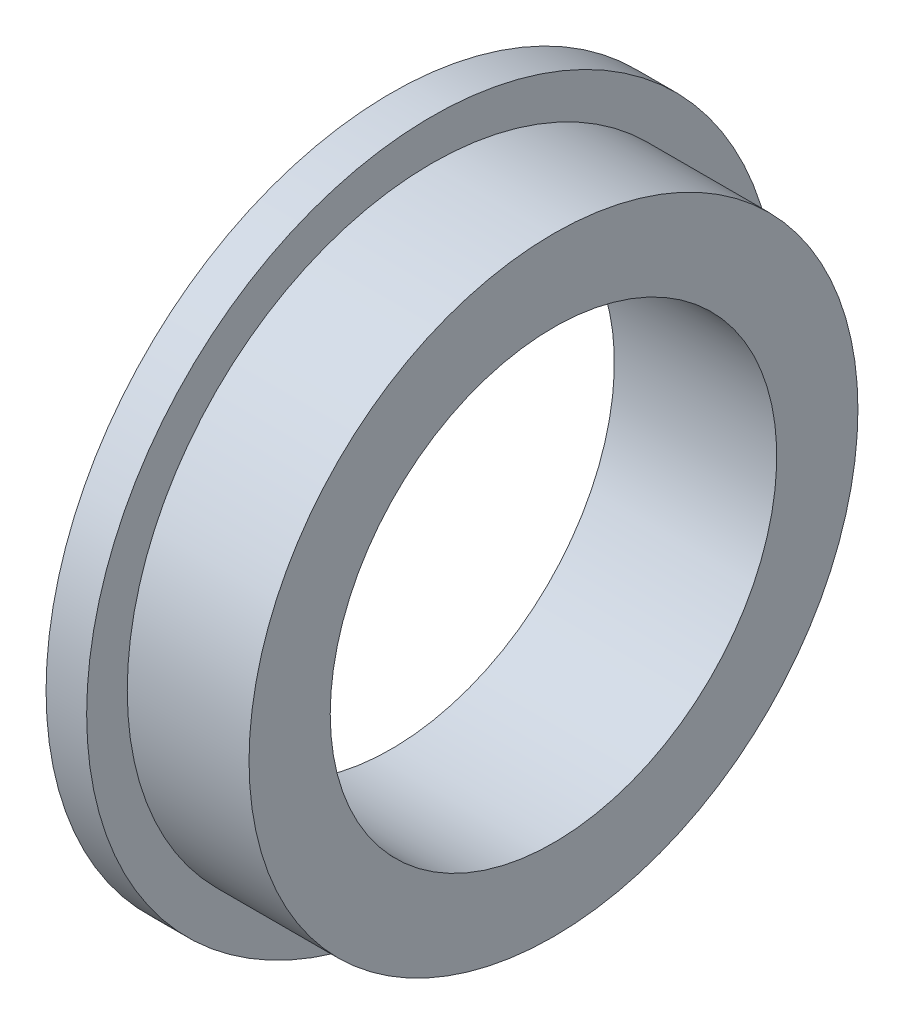
ISO-10303-21;
HEADER;
FILE_DESCRIPTION(('STEP AP214'),'2;1');
FILE_NAME('part.step','',(''),(''),'','','');
FILE_SCHEMA(('AUTOMOTIVE_DESIGN { 1 0 10303 214 1 1 1 1 }'));
ENDSEC;
DATA;
#1=APPLICATION_CONTEXT('core data for automotive mechanical design processes');
#2=APPLICATION_PROTOCOL_DEFINITION('international standard','automotive_design',2000,#1);
#3=PRODUCT_CONTEXT('',#1,'mechanical');
#4=PRODUCT('Part','Part','',(#3));
#5=PRODUCT_RELATED_PRODUCT_CATEGORY('part','',(#4));
#6=PRODUCT_DEFINITION_FORMATION('','',#4);
#7=PRODUCT_DEFINITION_CONTEXT('part definition',#1,'design');
#8=PRODUCT_DEFINITION('design','',#6,#7);
#9=PRODUCT_DEFINITION_SHAPE('','',#8);
#10=(LENGTH_UNIT() NAMED_UNIT(*) SI_UNIT(.MILLI.,.METRE.));
#11=(NAMED_UNIT(*) PLANE_ANGLE_UNIT() SI_UNIT($,.RADIAN.));
#12=(NAMED_UNIT(*) SI_UNIT($,.STERADIAN.) SOLID_ANGLE_UNIT());
#13=UNCERTAINTY_MEASURE_WITH_UNIT(LENGTH_MEASURE(1.E-05),#10,'distance_accuracy_value','');
#14=(GEOMETRIC_REPRESENTATION_CONTEXT(3) GLOBAL_UNCERTAINTY_ASSIGNED_CONTEXT((#13)) GLOBAL_UNIT_ASSIGNED_CONTEXT((#10,
#11,#12)) REPRESENTATION_CONTEXT('',''));
#15=CARTESIAN_POINT('',(0.,0.,0.));
#16=DIRECTION('',(0.,0.,1.));
#17=DIRECTION('',(1.,0.,0.));
#18=AXIS2_PLACEMENT_3D('',#15,#16,#17);
#19=CARTESIAN_POINT('',(-3.175,0.,0.));
#20=DIRECTION('',(-1.,0.,0.));
#21=DIRECTION('',(0.,0.,1.));
#22=AXIS2_PLACEMENT_3D('',#19,#20,#21);
#23=PLANE('',#22);
#24=CARTESIAN_POINT('',(-3.175,0.,0.));
#25=DIRECTION('',(-1.,0.,0.));
#26=DIRECTION('',(0.,0.,1.));
#27=AXIS2_PLACEMENT_3D('',#24,#25,#26);
#28=CIRCLE('',#27,26.9875);
#29=CARTESIAN_POINT('',(-3.175,0.,26.9875));
#30=VERTEX_POINT('',#29);
#31=EDGE_CURVE('E59',#30,#30,#28,.T.);
#32=ORIENTED_EDGE('',*,*,#31,.T.);
#33=EDGE_LOOP('',(#32));
#34=FACE_BOUND('',#33,.T.);
#35=CARTESIAN_POINT('',(-3.175,0.,0.));
#36=DIRECTION('',(-1.,0.,0.));
#37=DIRECTION('',(0.,0.,1.));
#38=AXIS2_PLACEMENT_3D('',#35,#36,#37);
#39=CIRCLE('',#38,17.4625);
#40=CARTESIAN_POINT('',(-3.175,0.,17.4625));
#41=VERTEX_POINT('',#40);
#42=EDGE_CURVE('E10',#41,#41,#39,.T.);
#43=ORIENTED_EDGE('',*,*,#42,.F.);
#44=EDGE_LOOP('',(#43));
#45=FACE_BOUND('',#44,.T.);
#46=ADVANCED_FACE('F37',(#34,#45),#23,.T.);
#47=CARTESIAN_POINT('',(-80.9218267021545,0.,0.));
#48=DIRECTION('',(-1.,0.,0.));
#49=DIRECTION('',(0.,0.,1.));
#50=AXIS2_PLACEMENT_3D('',#47,#48,#49);
#51=CYLINDRICAL_SURFACE('',#50,17.4625);
#52=ORIENTED_EDGE('',*,*,#42,.T.);
#53=EDGE_LOOP('',(#52));
#54=FACE_BOUND('',#53,.T.);
#55=CARTESIAN_POINT('',(9.52500000000001,0.,0.));
#56=DIRECTION('',(-1.,0.,0.));
#57=DIRECTION('',(0.,0.,1.));
#58=AXIS2_PLACEMENT_3D('',#55,#56,#57);
#59=CIRCLE('',#58,17.4625);
#60=CARTESIAN_POINT('',(9.52500000000001,0.,17.4625));
#61=VERTEX_POINT('',#60);
#62=EDGE_CURVE('E43',#61,#61,#59,.T.);
#63=ORIENTED_EDGE('',*,*,#62,.F.);
#64=EDGE_LOOP('',(#63));
#65=FACE_BOUND('',#64,.T.);
#66=ADVANCED_FACE('F77',(#54,#65),#51,.F.);
#67=CARTESIAN_POINT('',(9.525,0.,0.));
#68=DIRECTION('',(-1.,0.,0.));
#69=DIRECTION('',(0.,0.,1.));
#70=AXIS2_PLACEMENT_3D('',#67,#68,#69);
#71=PLANE('',#70);
#72=CARTESIAN_POINT('',(9.52500000000001,0.,0.));
#73=DIRECTION('',(-1.,0.,0.));
#74=DIRECTION('',(0.,0.,1.));
#75=AXIS2_PLACEMENT_3D('',#72,#73,#74);
#76=CIRCLE('',#75,23.8125);
#77=CARTESIAN_POINT('',(9.52500000000001,0.,23.8125));
#78=VERTEX_POINT('',#77);
#79=EDGE_CURVE('E47',#78,#78,#76,.T.);
#80=ORIENTED_EDGE('',*,*,#79,.F.);
#81=EDGE_LOOP('',(#80));
#82=FACE_BOUND('',#81,.T.);
#83=ORIENTED_EDGE('',*,*,#62,.T.);
#84=EDGE_LOOP('',(#83));
#85=FACE_BOUND('',#84,.T.);
#86=ADVANCED_FACE('F81',(#82,#85),#71,.F.);
#87=CARTESIAN_POINT('',(-80.9218267021545,0.,0.));
#88=DIRECTION('',(-1.,0.,0.));
#89=DIRECTION('',(0.,0.,1.));
#90=AXIS2_PLACEMENT_3D('',#87,#88,#89);
#91=CYLINDRICAL_SURFACE('',#90,23.8125);
#92=CARTESIAN_POINT('',(0.,0.,0.));
#93=DIRECTION('',(-1.,0.,0.));
#94=DIRECTION('',(0.,0.,1.));
#95=AXIS2_PLACEMENT_3D('',#92,#93,#94);
#96=CIRCLE('',#95,23.8125);
#97=CARTESIAN_POINT('',(0.,0.,23.8125));
#98=VERTEX_POINT('',#97);
#99=EDGE_CURVE('E51',#98,#98,#96,.T.);
#100=ORIENTED_EDGE('',*,*,#99,.F.);
#101=EDGE_LOOP('',(#100));
#102=FACE_BOUND('',#101,.T.);
#103=ORIENTED_EDGE('',*,*,#79,.T.);
#104=EDGE_LOOP('',(#103));
#105=FACE_BOUND('',#104,.T.);
#106=ADVANCED_FACE('F73',(#102,#105),#91,.T.);
#107=CARTESIAN_POINT('',(0.,0.,0.));
#108=DIRECTION('',(-1.,0.,0.));
#109=DIRECTION('',(0.,0.,1.));
#110=AXIS2_PLACEMENT_3D('',#107,#108,#109);
#111=PLANE('',#110);
#112=CARTESIAN_POINT('',(0.,0.,0.));
#113=DIRECTION('',(-1.,0.,0.));
#114=DIRECTION('',(0.,0.,1.));
#115=AXIS2_PLACEMENT_3D('',#112,#113,#114);
#116=CIRCLE('',#115,26.9875);
#117=CARTESIAN_POINT('',(0.,0.,26.9875));
#118=VERTEX_POINT('',#117);
#119=EDGE_CURVE('E56',#118,#118,#116,.T.);
#120=ORIENTED_EDGE('',*,*,#119,.F.);
#121=EDGE_LOOP('',(#120));
#122=FACE_BOUND('',#121,.T.);
#123=ORIENTED_EDGE('',*,*,#99,.T.);
#124=EDGE_LOOP('',(#123));
#125=FACE_BOUND('',#124,.T.);
#126=ADVANCED_FACE('F67',(#122,#125),#111,.F.);
#127=CARTESIAN_POINT('',(-80.9218267021545,0.,0.));
#128=DIRECTION('',(-1.,0.,0.));
#129=DIRECTION('',(0.,0.,1.));
#130=AXIS2_PLACEMENT_3D('',#127,#128,#129);
#131=CYLINDRICAL_SURFACE('',#130,26.9875);
#132=ORIENTED_EDGE('',*,*,#119,.T.);
#133=EDGE_LOOP('',(#132));
#134=FACE_BOUND('',#133,.T.);
#135=ORIENTED_EDGE('',*,*,#31,.F.);
#136=EDGE_LOOP('',(#135));
#137=FACE_BOUND('',#136,.T.);
#138=ADVANCED_FACE('F65',(#134,#137),#131,.T.);
#139=CLOSED_SHELL('',(#46,#66,#86,#106,#126,#138));
#140=MANIFOLD_SOLID_BREP('B2',#139);
#141=ADVANCED_BREP_SHAPE_REPRESENTATION('',(#18,#140),#14);
#142=SHAPE_DEFINITION_REPRESENTATION(#9,#141);
ENDSEC;
END-ISO-10303-21;
